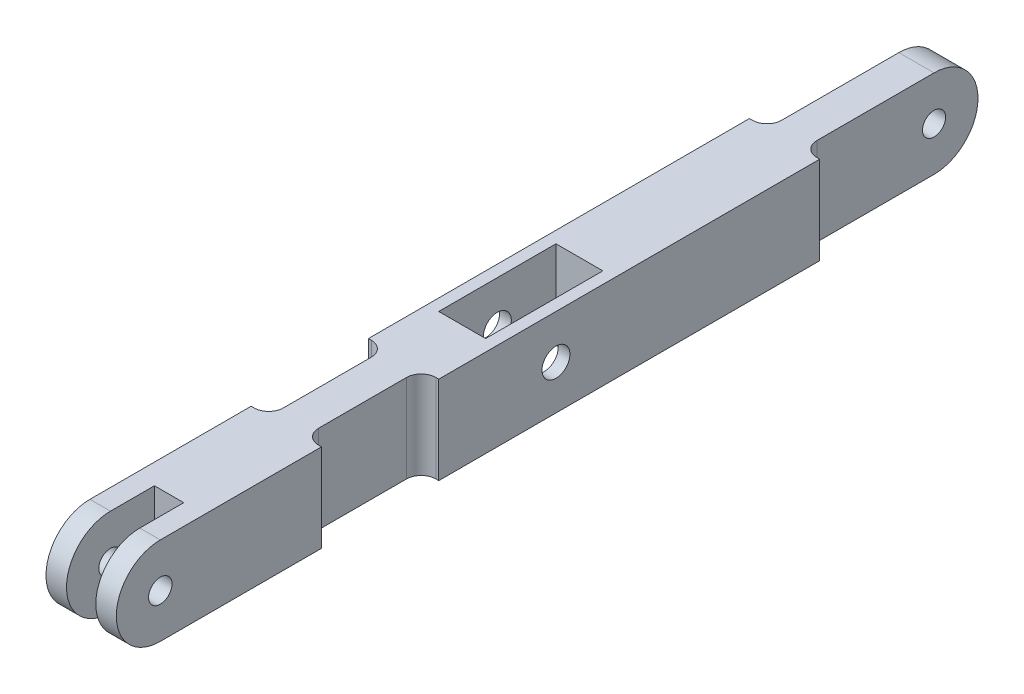
ISO-10303-21;
HEADER;
FILE_DESCRIPTION(('STEP AP214'),'2;1');
FILE_NAME('part.step','',(''),(''),'','','');
FILE_SCHEMA(('AUTOMOTIVE_DESIGN { 1 0 10303 214 1 1 1 1 }'));
ENDSEC;
DATA;
#1=APPLICATION_CONTEXT('core data for automotive mechanical design processes');
#2=APPLICATION_PROTOCOL_DEFINITION('international standard','automotive_design',2000,#1);
#3=PRODUCT_CONTEXT('',#1,'mechanical');
#4=PRODUCT('Part','Part','',(#3));
#5=PRODUCT_RELATED_PRODUCT_CATEGORY('part','',(#4));
#6=PRODUCT_DEFINITION_FORMATION('','',#4);
#7=PRODUCT_DEFINITION_CONTEXT('part definition',#1,'design');
#8=PRODUCT_DEFINITION('design','',#6,#7);
#9=PRODUCT_DEFINITION_SHAPE('','',#8);
#10=(LENGTH_UNIT() NAMED_UNIT(*) SI_UNIT(.MILLI.,.METRE.));
#11=(NAMED_UNIT(*) PLANE_ANGLE_UNIT() SI_UNIT($,.RADIAN.));
#12=(NAMED_UNIT(*) SI_UNIT($,.STERADIAN.) SOLID_ANGLE_UNIT());
#13=UNCERTAINTY_MEASURE_WITH_UNIT(LENGTH_MEASURE(1.E-05),#10,'distance_accuracy_value','');
#14=(GEOMETRIC_REPRESENTATION_CONTEXT(3) GLOBAL_UNCERTAINTY_ASSIGNED_CONTEXT((#13)) GLOBAL_UNIT_ASSIGNED_CONTEXT((#10,
#11,#12)) REPRESENTATION_CONTEXT('',''));
#15=CARTESIAN_POINT('',(0.,0.,0.));
#16=DIRECTION('',(0.,0.,1.));
#17=DIRECTION('',(1.,0.,0.));
#18=AXIS2_PLACEMENT_3D('',#15,#16,#17);
#19=CARTESIAN_POINT('',(6.,0.,67.5));
#20=DIRECTION('',(1.,0.,0.));
#21=DIRECTION('',(0.,0.,-1.));
#22=AXIS2_PLACEMENT_3D('',#19,#20,#21);
#23=PLANE('',#22);
#24=DIRECTION('',(0.,-1.,0.));
#25=VECTOR('',#24,1.);
#26=CARTESIAN_POINT('',(6.,0.,-45.));
#27=LINE('',#26,#25);
#28=CARTESIAN_POINT('',(6.,7.50000000000002,-45.));
#29=VERTEX_POINT('',#28);
#30=CARTESIAN_POINT('',(6.,-7.50000000000002,-45.));
#31=VERTEX_POINT('',#30);
#32=EDGE_CURVE('E362',#29,#31,#27,.T.);
#33=ORIENTED_EDGE('',*,*,#32,.F.);
#34=DIRECTION('',(0.,0.,1.));
#35=VECTOR('',#34,1.);
#36=CARTESIAN_POINT('',(6.,7.5,67.5));
#37=LINE('',#36,#35);
#38=CARTESIAN_POINT('',(6.,7.50000000000002,20.));
#39=VERTEX_POINT('',#38);
#40=EDGE_CURVE('E394',#29,#39,#37,.T.);
#41=ORIENTED_EDGE('',*,*,#40,.T.);
#42=DIRECTION('',(0.,1.,0.));
#43=VECTOR('',#42,1.);
#44=CARTESIAN_POINT('',(6.,0.,20.));
#45=LINE('',#44,#43);
#46=CARTESIAN_POINT('',(6.,-7.50000000000002,20.));
#47=VERTEX_POINT('',#46);
#48=EDGE_CURVE('E356',#47,#39,#45,.T.);
#49=ORIENTED_EDGE('',*,*,#48,.F.);
#50=DIRECTION('',(0.,0.,-1.));
#51=VECTOR('',#50,1.);
#52=CARTESIAN_POINT('',(6.,-7.5,67.5));
#53=LINE('',#52,#51);
#54=EDGE_CURVE('E387',#47,#31,#53,.T.);
#55=ORIENTED_EDGE('',*,*,#54,.T.);
#56=EDGE_LOOP('',(#33,#41,#49,#55));
#57=FACE_BOUND('',#56,.T.);
#58=CARTESIAN_POINT('',(6.,0.,0.));
#59=DIRECTION('',(1.,0.,0.));
#60=DIRECTION('',(0.,0.,-1.));
#61=AXIS2_PLACEMENT_3D('',#58,#59,#60);
#62=CIRCLE('',#61,2.38125);
#63=CARTESIAN_POINT('',(6.,0.,-2.38125));
#64=VERTEX_POINT('',#63);
#65=EDGE_CURVE('E372',#64,#64,#62,.T.);
#66=ORIENTED_EDGE('',*,*,#65,.F.);
#67=EDGE_LOOP('',(#66));
#68=FACE_BOUND('',#67,.T.);
#69=ADVANCED_FACE('F37',(#57,#68),#23,.T.);
#70=CARTESIAN_POINT('',(-6.,0.,67.5));
#71=DIRECTION('',(1.,0.,0.));
#72=DIRECTION('',(0.,0.,-1.));
#73=AXIS2_PLACEMENT_3D('',#70,#71,#72);
#74=PLANE('',#73);
#75=CARTESIAN_POINT('',(-6.,0.,67.5));
#76=DIRECTION('',(1.,0.,0.));
#77=DIRECTION('',(0.,0.,-1.));
#78=AXIS2_PLACEMENT_3D('',#75,#76,#77);
#79=CIRCLE('',#78,2.);
#80=CARTESIAN_POINT('',(-6.,0.,65.5));
#81=VERTEX_POINT('',#80);
#82=EDGE_CURVE('E375',#81,#81,#79,.T.);
#83=ORIENTED_EDGE('',*,*,#82,.T.);
#84=EDGE_LOOP('',(#83));
#85=FACE_BOUND('',#84,.T.);
#86=DIRECTION('',(0.,0.,1.));
#87=VECTOR('',#86,1.);
#88=CARTESIAN_POINT('',(-6.,7.5,67.5));
#89=LINE('',#88,#87);
#90=CARTESIAN_POINT('',(-6.,7.50000000000002,40.));
#91=VERTEX_POINT('',#90);
#92=CARTESIAN_POINT('',(-6.,7.5,67.5));
#93=VERTEX_POINT('',#92);
#94=EDGE_CURVE('E401',#91,#93,#89,.T.);
#95=ORIENTED_EDGE('',*,*,#94,.F.);
#96=DIRECTION('',(0.,-1.,0.));
#97=VECTOR('',#96,1.);
#98=CARTESIAN_POINT('',(-6.,0.,40.));
#99=LINE('',#98,#97);
#100=CARTESIAN_POINT('',(-6.,-7.50000000000002,40.));
#101=VERTEX_POINT('',#100);
#102=EDGE_CURVE('E368',#91,#101,#99,.T.);
#103=ORIENTED_EDGE('',*,*,#102,.T.);
#104=DIRECTION('',(0.,0.,-1.));
#105=VECTOR('',#104,1.);
#106=CARTESIAN_POINT('',(-6.,-7.5,67.5));
#107=LINE('',#106,#105);
#108=CARTESIAN_POINT('',(-6.,-7.5,67.5));
#109=VERTEX_POINT('',#108);
#110=EDGE_CURVE('E398',#109,#101,#107,.T.);
#111=ORIENTED_EDGE('',*,*,#110,.F.);
#112=CARTESIAN_POINT('',(-6.,0.,67.5));
#113=DIRECTION('',(1.,0.,0.));
#114=DIRECTION('',(0.,0.,-1.));
#115=AXIS2_PLACEMENT_3D('',#112,#113,#114);
#116=CIRCLE('',#115,7.5);
#117=EDGE_CURVE('E381',#93,#109,#116,.T.);
#118=ORIENTED_EDGE('',*,*,#117,.F.);
#119=EDGE_LOOP('',(#95,#103,#111,#118));
#120=FACE_BOUND('',#119,.T.);
#121=ADVANCED_FACE('F518',(#85,#120),#74,.F.);
#122=CARTESIAN_POINT('',(6.,0.,67.5));
#123=DIRECTION('',(-1.,0.,0.));
#124=DIRECTION('',(0.,0.,1.));
#125=AXIS2_PLACEMENT_3D('',#122,#123,#124);
#126=CYLINDRICAL_SURFACE('',#125,7.5);
#127=DIRECTION('',(-1.,0.,0.));
#128=VECTOR('',#127,1.);
#129=CARTESIAN_POINT('',(6.,-7.5,67.5));
#130=LINE('',#129,#128);
#131=CARTESIAN_POINT('',(-2.5,-7.50000000000002,67.5));
#132=VERTEX_POINT('',#131);
#133=EDGE_CURVE('E414',#132,#109,#130,.T.);
#134=ORIENTED_EDGE('',*,*,#133,.F.);
#135=CARTESIAN_POINT('',(-2.5,0.,67.5));
#136=DIRECTION('',(-1.,0.,0.));
#137=DIRECTION('',(0.,0.,1.));
#138=AXIS2_PLACEMENT_3D('',#135,#136,#137);
#139=CIRCLE('',#138,7.5);
#140=CARTESIAN_POINT('',(-2.5,7.50000000000002,67.5));
#141=VERTEX_POINT('',#140);
#142=EDGE_CURVE('E350',#132,#141,#139,.T.);
#143=ORIENTED_EDGE('',*,*,#142,.T.);
#144=DIRECTION('',(-1.,0.,0.));
#145=VECTOR('',#144,1.);
#146=CARTESIAN_POINT('',(6.,7.5,67.5));
#147=LINE('',#146,#145);
#148=EDGE_CURVE('E408',#141,#93,#147,.T.);
#149=ORIENTED_EDGE('',*,*,#148,.T.);
#150=ORIENTED_EDGE('',*,*,#117,.T.);
#151=EDGE_LOOP('',(#134,#143,#149,#150));
#152=FACE_BOUND('',#151,.T.);
#153=ADVANCED_FACE('F571',(#152),#126,.T.);
#154=CARTESIAN_POINT('',(6.,0.,67.5));
#155=DIRECTION('',(-1.,0.,0.));
#156=DIRECTION('',(0.,0.,1.));
#157=AXIS2_PLACEMENT_3D('',#154,#155,#156);
#158=CYLINDRICAL_SURFACE('',#157,2.);
#159=CARTESIAN_POINT('',(-2.5,0.,67.5));
#160=DIRECTION('',(-1.,0.,0.));
#161=DIRECTION('',(0.,0.,1.));
#162=AXIS2_PLACEMENT_3D('',#159,#160,#161);
#163=CIRCLE('',#162,2.);
#164=CARTESIAN_POINT('',(-2.5,0.,69.5));
#165=VERTEX_POINT('',#164);
#166=EDGE_CURVE('E348',#165,#165,#163,.T.);
#167=ORIENTED_EDGE('',*,*,#166,.F.);
#168=EDGE_LOOP('',(#167));
#169=FACE_BOUND('',#168,.T.);
#170=ORIENTED_EDGE('',*,*,#82,.F.);
#171=EDGE_LOOP('',(#170));
#172=FACE_BOUND('',#171,.T.);
#173=ADVANCED_FACE('F601',(#169,#172),#158,.F.);
#174=CARTESIAN_POINT('',(6.,0.,0.));
#175=DIRECTION('',(-1.,0.,0.));
#176=DIRECTION('',(0.,0.,1.));
#177=AXIS2_PLACEMENT_3D('',#174,#175,#176);
#178=CYLINDRICAL_SURFACE('',#177,2.38125);
#179=CARTESIAN_POINT('',(4.,0.,0.));
#180=DIRECTION('',(1.,0.,0.));
#181=DIRECTION('',(0.,0.,-1.));
#182=AXIS2_PLACEMENT_3D('',#179,#180,#181);
#183=CIRCLE('',#182,2.38125);
#184=CARTESIAN_POINT('',(4.,0.,-2.38125));
#185=VERTEX_POINT('',#184);
#186=EDGE_CURVE('E425',#185,#185,#183,.T.);
#187=ORIENTED_EDGE('',*,*,#186,.F.);
#188=EDGE_LOOP('',(#187));
#189=FACE_BOUND('',#188,.T.);
#190=ORIENTED_EDGE('',*,*,#65,.T.);
#191=EDGE_LOOP('',(#190));
#192=FACE_BOUND('',#191,.T.);
#193=ADVANCED_FACE('F595',(#189,#192),#178,.F.);
#194=DIRECTION('',(0.,-1.,0.));
#195=VECTOR('',#194,1.);
#196=CARTESIAN_POINT('',(6.,0.,40.));
#197=LINE('',#196,#195);
#198=CARTESIAN_POINT('',(6.,7.50000000000002,40.));
#199=VERTEX_POINT('',#198);
#200=CARTESIAN_POINT('',(6.,-7.50000000000002,40.));
#201=VERTEX_POINT('',#200);
#202=EDGE_CURVE('E353',#199,#201,#197,.T.);
#203=ORIENTED_EDGE('',*,*,#202,.F.);
#204=CARTESIAN_POINT('',(6.,7.5,67.5));
#205=VERTEX_POINT('',#204);
#206=EDGE_CURVE('E392',#199,#205,#37,.T.);
#207=ORIENTED_EDGE('',*,*,#206,.T.);
#208=CARTESIAN_POINT('',(6.,0.,67.5));
#209=DIRECTION('',(1.,0.,0.));
#210=DIRECTION('',(0.,0.,-1.));
#211=AXIS2_PLACEMENT_3D('',#208,#209,#210);
#212=CIRCLE('',#211,7.5);
#213=CARTESIAN_POINT('',(6.,-7.5,67.5));
#214=VERTEX_POINT('',#213);
#215=EDGE_CURVE('E384',#205,#214,#212,.T.);
#216=ORIENTED_EDGE('',*,*,#215,.T.);
#217=EDGE_CURVE('E389',#214,#201,#53,.T.);
#218=ORIENTED_EDGE('',*,*,#217,.T.);
#219=EDGE_LOOP('',(#203,#207,#216,#218));
#220=FACE_BOUND('',#219,.T.);
#221=CARTESIAN_POINT('',(6.,0.,67.5));
#222=DIRECTION('',(1.,0.,0.));
#223=DIRECTION('',(0.,0.,-1.));
#224=AXIS2_PLACEMENT_3D('',#221,#222,#223);
#225=CIRCLE('',#224,2.);
#226=CARTESIAN_POINT('',(6.,0.,65.5));
#227=VERTEX_POINT('',#226);
#228=EDGE_CURVE('E378',#227,#227,#225,.T.);
#229=ORIENTED_EDGE('',*,*,#228,.F.);
#230=EDGE_LOOP('',(#229));
#231=FACE_BOUND('',#230,.T.);
#232=ADVANCED_FACE('F557',(#220,#231),#23,.T.);
#233=CARTESIAN_POINT('',(-6.,-7.50000000000002,20.));
#234=VERTEX_POINT('',#233);
#235=CARTESIAN_POINT('',(-6.,-7.50000000000002,-45.));
#236=VERTEX_POINT('',#235);
#237=EDGE_CURVE('E397',#234,#236,#107,.T.);
#238=ORIENTED_EDGE('',*,*,#237,.F.);
#239=DIRECTION('',(0.,1.,0.));
#240=VECTOR('',#239,1.);
#241=CARTESIAN_POINT('',(-6.,0.,20.));
#242=LINE('',#241,#240);
#243=CARTESIAN_POINT('',(-6.,7.50000000000002,20.));
#244=VERTEX_POINT('',#243);
#245=EDGE_CURVE('E365',#234,#244,#242,.T.);
#246=ORIENTED_EDGE('',*,*,#245,.T.);
#247=CARTESIAN_POINT('',(-6.,7.50000000000002,-45.));
#248=VERTEX_POINT('',#247);
#249=EDGE_CURVE('E388',#248,#244,#89,.T.);
#250=ORIENTED_EDGE('',*,*,#249,.F.);
#251=DIRECTION('',(0.,-1.,0.));
#252=VECTOR('',#251,1.);
#253=CARTESIAN_POINT('',(-6.,0.,-45.));
#254=LINE('',#253,#252);
#255=EDGE_CURVE('E359',#248,#236,#254,.T.);
#256=ORIENTED_EDGE('',*,*,#255,.T.);
#257=EDGE_LOOP('',(#238,#246,#250,#256));
#258=FACE_BOUND('',#257,.T.);
#259=CARTESIAN_POINT('',(-6.,0.,0.));
#260=DIRECTION('',(1.,0.,0.));
#261=DIRECTION('',(0.,0.,-1.));
#262=AXIS2_PLACEMENT_3D('',#259,#260,#261);
#263=CIRCLE('',#262,2.38125);
#264=CARTESIAN_POINT('',(-6.,0.,-2.38125));
#265=VERTEX_POINT('',#264);
#266=EDGE_CURVE('E371',#265,#265,#263,.T.);
#267=ORIENTED_EDGE('',*,*,#266,.T.);
#268=EDGE_LOOP('',(#267));
#269=FACE_BOUND('',#268,.T.);
#270=ADVANCED_FACE('F592',(#258,#269),#74,.F.);
#271=CARTESIAN_POINT('',(2.5,7.5,67.5));
#272=VERTEX_POINT('',#271);
#273=EDGE_CURVE('E404',#205,#272,#147,.T.);
#274=ORIENTED_EDGE('',*,*,#273,.T.);
#275=CARTESIAN_POINT('',(2.5,0.,67.5));
#276=DIRECTION('',(1.,0.,0.));
#277=DIRECTION('',(0.,0.,-1.));
#278=AXIS2_PLACEMENT_3D('',#275,#276,#277);
#279=CIRCLE('',#278,7.5);
#280=CARTESIAN_POINT('',(2.5,-7.50000000000002,67.5));
#281=VERTEX_POINT('',#280);
#282=EDGE_CURVE('E345',#272,#281,#279,.T.);
#283=ORIENTED_EDGE('',*,*,#282,.T.);
#284=EDGE_CURVE('E415',#214,#281,#130,.T.);
#285=ORIENTED_EDGE('',*,*,#284,.F.);
#286=ORIENTED_EDGE('',*,*,#215,.F.);
#287=EDGE_LOOP('',(#274,#283,#285,#286));
#288=FACE_BOUND('',#287,.T.);
#289=ADVANCED_FACE('F561',(#288),#126,.T.);
#290=CARTESIAN_POINT('',(6.,-7.5,67.5));
#291=DIRECTION('',(0.,1.,0.));
#292=DIRECTION('',(0.,0.,1.));
#293=AXIS2_PLACEMENT_3D('',#290,#291,#292);
#294=PLANE('',#293);
#295=DIRECTION('',(1.,0.,0.));
#296=VECTOR('',#295,1.);
#297=CARTESIAN_POINT('',(-4.,-7.50000000000002,10.));
#298=LINE('',#297,#296);
#299=CARTESIAN_POINT('',(-4.,-7.50000000000002,10.));
#300=VERTEX_POINT('',#299);
#301=CARTESIAN_POINT('',(4.,-7.50000000000002,10.));
#302=VERTEX_POINT('',#301);
#303=EDGE_CURVE('E267',#300,#302,#298,.T.);
#304=ORIENTED_EDGE('',*,*,#303,.T.);
#305=DIRECTION('',(0.,0.,-1.));
#306=VECTOR('',#305,1.);
#307=CARTESIAN_POINT('',(4.,-7.50000000000002,10.));
#308=LINE('',#307,#306);
#309=CARTESIAN_POINT('',(4.,-7.50000000000002,-10.));
#310=VERTEX_POINT('',#309);
#311=EDGE_CURVE('E258',#302,#310,#308,.T.);
#312=ORIENTED_EDGE('',*,*,#311,.T.);
#313=DIRECTION('',(-1.,0.,0.));
#314=VECTOR('',#313,1.);
#315=CARTESIAN_POINT('',(-4.,-7.50000000000002,-10.));
#316=LINE('',#315,#314);
#317=CARTESIAN_POINT('',(-4.,-7.49999999999998,-9.99999999999999));
#318=VERTEX_POINT('',#317);
#319=EDGE_CURVE('E264',#310,#318,#316,.T.);
#320=ORIENTED_EDGE('',*,*,#319,.T.);
#321=DIRECTION('',(0.,0.,1.));
#322=VECTOR('',#321,1.);
#323=CARTESIAN_POINT('',(-4.,-7.50000000000002,10.));
#324=LINE('',#323,#322);
#325=EDGE_CURVE('E239',#318,#300,#324,.T.);
#326=ORIENTED_EDGE('',*,*,#325,.T.);
#327=EDGE_LOOP('',(#304,#312,#320,#326));
#328=FACE_BOUND('',#327,.T.);
#329=DIRECTION('',(-1.,0.,0.));
#330=VECTOR('',#329,1.);
#331=CARTESIAN_POINT('',(-2.5,-7.50000000000002,59.9999999999999));
#332=LINE('',#331,#330);
#333=CARTESIAN_POINT('',(2.5,-7.50000000000002,59.9999999999999));
#334=VERTEX_POINT('',#333);
#335=CARTESIAN_POINT('',(-2.5,-7.50000000000002,59.9999999999999));
#336=VERTEX_POINT('',#335);
#337=EDGE_CURVE('E286',#334,#336,#332,.T.);
#338=ORIENTED_EDGE('',*,*,#337,.T.);
#339=DIRECTION('',(0.,0.,1.));
#340=VECTOR('',#339,1.);
#341=CARTESIAN_POINT('',(-2.5,-7.50000000000002,89.9999999999999));
#342=LINE('',#341,#340);
#343=EDGE_CURVE('E289',#336,#132,#342,.T.);
#344=ORIENTED_EDGE('',*,*,#343,.T.);
#345=ORIENTED_EDGE('',*,*,#133,.T.);
#346=ORIENTED_EDGE('',*,*,#110,.T.);
#347=DIRECTION('',(1.,0.,0.));
#348=VECTOR('',#347,1.);
#349=CARTESIAN_POINT('',(-9.,-7.50000000000002,40.));
#350=LINE('',#349,#348);
#351=CARTESIAN_POINT('',(-5.5,-7.50000000000002,40.));
#352=VERTEX_POINT('',#351);
#353=EDGE_CURVE('E278',#101,#352,#350,.T.);
#354=ORIENTED_EDGE('',*,*,#353,.T.);
#355=CARTESIAN_POINT('',(-5.5,-7.49999999999999,37.5));
#356=DIRECTION('',(0.,1.,0.));
#357=DIRECTION('',(0.,0.,1.));
#358=AXIS2_PLACEMENT_3D('',#355,#356,#357);
#359=CIRCLE('',#358,2.5);
#360=CARTESIAN_POINT('',(-3.,-7.50000000000002,37.5));
#361=VERTEX_POINT('',#360);
#362=EDGE_CURVE('E480',#352,#361,#359,.T.);
#363=ORIENTED_EDGE('',*,*,#362,.T.);
#364=DIRECTION('',(0.,0.,-1.));
#365=VECTOR('',#364,1.);
#366=CARTESIAN_POINT('',(-3.,-7.50000000000002,40.));
#367=LINE('',#366,#365);
#368=CARTESIAN_POINT('',(-3.,-7.50000000000002,22.5));
#369=VERTEX_POINT('',#368);
#370=EDGE_CURVE('E304',#361,#369,#367,.T.);
#371=ORIENTED_EDGE('',*,*,#370,.T.);
#372=CARTESIAN_POINT('',(-5.5,-7.49999999999999,22.5));
#373=DIRECTION('',(0.,1.,0.));
#374=DIRECTION('',(0.,0.,1.));
#375=AXIS2_PLACEMENT_3D('',#372,#373,#374);
#376=CIRCLE('',#375,2.5);
#377=CARTESIAN_POINT('',(-5.5,-7.50000000000002,20.));
#378=VERTEX_POINT('',#377);
#379=EDGE_CURVE('E484',#369,#378,#376,.T.);
#380=ORIENTED_EDGE('',*,*,#379,.T.);
#381=DIRECTION('',(-1.,0.,0.));
#382=VECTOR('',#381,1.);
#383=CARTESIAN_POINT('',(-9.,-7.50000000000002,20.));
#384=LINE('',#383,#382);
#385=EDGE_CURVE('E307',#378,#234,#384,.T.);
#386=ORIENTED_EDGE('',*,*,#385,.T.);
#387=ORIENTED_EDGE('',*,*,#237,.T.);
#388=DIRECTION('',(1.,0.,0.));
#389=VECTOR('',#388,1.);
#390=CARTESIAN_POINT('',(-9.,-7.50000000000002,-45.));
#391=LINE('',#390,#389);
#392=CARTESIAN_POINT('',(-5.5,-7.50000000000002,-45.));
#393=VERTEX_POINT('',#392);
#394=EDGE_CURVE('E322',#236,#393,#391,.T.);
#395=ORIENTED_EDGE('',*,*,#394,.T.);
#396=CARTESIAN_POINT('',(-5.5,-7.49999999999998,-47.5));
#397=DIRECTION('',(0.,1.,0.));
#398=DIRECTION('',(0.,0.,1.));
#399=AXIS2_PLACEMENT_3D('',#396,#397,#398);
#400=CIRCLE('',#399,2.5);
#401=CARTESIAN_POINT('',(-3.,-7.50000000000002,-47.5));
#402=VERTEX_POINT('',#401);
#403=EDGE_CURVE('E11',#393,#402,#400,.T.);
#404=ORIENTED_EDGE('',*,*,#403,.T.);
#405=DIRECTION('',(0.,0.,-1.));
#406=VECTOR('',#405,1.);
#407=CARTESIAN_POINT('',(-3.,-7.50000000000002,-45.));
#408=LINE('',#407,#406);
#409=CARTESIAN_POINT('',(-3.,-7.50000000000002,-67.5));
#410=VERTEX_POINT('',#409);
#411=EDGE_CURVE('E315',#402,#410,#408,.T.);
#412=ORIENTED_EDGE('',*,*,#411,.T.);
#413=DIRECTION('',(-1.,0.,0.));
#414=VECTOR('',#413,1.);
#415=CARTESIAN_POINT('',(6.,-7.5,-67.5));
#416=LINE('',#415,#414);
#417=CARTESIAN_POINT('',(3.,-7.50000000000002,-67.5));
#418=VERTEX_POINT('',#417);
#419=EDGE_CURVE('E411',#418,#410,#416,.T.);
#420=ORIENTED_EDGE('',*,*,#419,.F.);
#421=DIRECTION('',(0.,0.,1.));
#422=VECTOR('',#421,1.);
#423=CARTESIAN_POINT('',(3.,-7.50000000000002,-45.));
#424=LINE('',#423,#422);
#425=CARTESIAN_POINT('',(3.,-7.50000000000002,-47.5));
#426=VERTEX_POINT('',#425);
#427=EDGE_CURVE('E317',#418,#426,#424,.T.);
#428=ORIENTED_EDGE('',*,*,#427,.T.);
#429=CARTESIAN_POINT('',(5.5,-7.49999999999998,-47.5));
#430=DIRECTION('',(0.,1.,0.));
#431=DIRECTION('',(0.,0.,1.));
#432=AXIS2_PLACEMENT_3D('',#429,#430,#431);
#433=CIRCLE('',#432,2.5);
#434=CARTESIAN_POINT('',(5.5,-7.50000000000002,-45.));
#435=VERTEX_POINT('',#434);
#436=EDGE_CURVE('E468',#426,#435,#433,.T.);
#437=ORIENTED_EDGE('',*,*,#436,.T.);
#438=DIRECTION('',(1.,0.,0.));
#439=VECTOR('',#438,1.);
#440=CARTESIAN_POINT('',(9.,-7.50000000000002,-45.));
#441=LINE('',#440,#439);
#442=EDGE_CURVE('E302',#435,#31,#441,.T.);
#443=ORIENTED_EDGE('',*,*,#442,.T.);
#444=ORIENTED_EDGE('',*,*,#54,.F.);
#445=DIRECTION('',(-1.,0.,0.));
#446=VECTOR('',#445,1.);
#447=CARTESIAN_POINT('',(9.,-7.50000000000002,20.));
#448=LINE('',#447,#446);
#449=CARTESIAN_POINT('',(5.5,-7.50000000000002,20.));
#450=VERTEX_POINT('',#449);
#451=EDGE_CURVE('E329',#47,#450,#448,.T.);
#452=ORIENTED_EDGE('',*,*,#451,.T.);
#453=CARTESIAN_POINT('',(5.5,-7.49999999999999,22.5));
#454=DIRECTION('',(0.,1.,0.));
#455=DIRECTION('',(0.,0.,1.));
#456=AXIS2_PLACEMENT_3D('',#453,#454,#455);
#457=CIRCLE('',#456,2.5);
#458=CARTESIAN_POINT('',(3.,-7.50000000000002,22.5));
#459=VERTEX_POINT('',#458);
#460=EDGE_CURVE('E476',#450,#459,#457,.T.);
#461=ORIENTED_EDGE('',*,*,#460,.T.);
#462=DIRECTION('',(0.,0.,1.));
#463=VECTOR('',#462,1.);
#464=CARTESIAN_POINT('',(3.,-7.50000000000002,40.));
#465=LINE('',#464,#463);
#466=CARTESIAN_POINT('',(3.,-7.50000000000002,37.5));
#467=VERTEX_POINT('',#466);
#468=EDGE_CURVE('E332',#459,#467,#465,.T.);
#469=ORIENTED_EDGE('',*,*,#468,.T.);
#470=CARTESIAN_POINT('',(5.5,-7.49999999999999,37.5));
#471=DIRECTION('',(0.,1.,0.));
#472=DIRECTION('',(0.,0.,1.));
#473=AXIS2_PLACEMENT_3D('',#470,#471,#472);
#474=CIRCLE('',#473,2.5);
#475=CARTESIAN_POINT('',(5.5,-7.50000000000002,40.));
#476=VERTEX_POINT('',#475);
#477=EDGE_CURVE('E472',#467,#476,#474,.T.);
#478=ORIENTED_EDGE('',*,*,#477,.T.);
#479=DIRECTION('',(1.,0.,0.));
#480=VECTOR('',#479,1.);
#481=CARTESIAN_POINT('',(9.,-7.50000000000002,40.));
#482=LINE('',#481,#480);
#483=EDGE_CURVE('E335',#476,#201,#482,.T.);
#484=ORIENTED_EDGE('',*,*,#483,.T.);
#485=ORIENTED_EDGE('',*,*,#217,.F.);
#486=ORIENTED_EDGE('',*,*,#284,.T.);
#487=DIRECTION('',(0.,0.,-1.));
#488=VECTOR('',#487,1.);
#489=CARTESIAN_POINT('',(2.5,-7.50000000000002,89.9999999999999));
#490=LINE('',#489,#488);
#491=EDGE_CURVE('E283',#281,#334,#490,.T.);
#492=ORIENTED_EDGE('',*,*,#491,.T.);
#493=EDGE_LOOP('',(#338,#344,#345,#346,#354,#363,#371,#380,#386,#387,#395,#404,#412,#420,#428,
#437,#443,#444,#452,#461,#469,#478,#484,#485,#486,#492));
#494=FACE_BOUND('',#493,.T.);
#495=ADVANCED_FACE('F488',(#328,#494),#294,.F.);
#496=CARTESIAN_POINT('',(6.,0.,-67.5));
#497=DIRECTION('',(-1.,0.,0.));
#498=DIRECTION('',(0.,0.,1.));
#499=AXIS2_PLACEMENT_3D('',#496,#497,#498);
#500=CYLINDRICAL_SURFACE('',#499,7.5);
#501=DIRECTION('',(-1.,0.,0.));
#502=VECTOR('',#501,1.);
#503=CARTESIAN_POINT('',(6.,7.50000000000002,-67.5));
#504=LINE('',#503,#502);
#505=CARTESIAN_POINT('',(3.,7.50000000000002,-67.5));
#506=VERTEX_POINT('',#505);
#507=CARTESIAN_POINT('',(-3.,7.50000000000002,-67.5));
#508=VERTEX_POINT('',#507);
#509=EDGE_CURVE('E407',#506,#508,#504,.T.);
#510=ORIENTED_EDGE('',*,*,#509,.F.);
#511=CARTESIAN_POINT('',(3.,0.,-67.5));
#512=DIRECTION('',(-1.,0.,0.));
#513=DIRECTION('',(0.,0.,1.));
#514=AXIS2_PLACEMENT_3D('',#511,#512,#513);
#515=CIRCLE('',#514,7.5);
#516=EDGE_CURVE('E342',#506,#418,#515,.T.);
#517=ORIENTED_EDGE('',*,*,#516,.T.);
#518=ORIENTED_EDGE('',*,*,#419,.T.);
#519=CARTESIAN_POINT('',(-3.,0.,-67.5));
#520=DIRECTION('',(1.,0.,0.));
#521=DIRECTION('',(0.,0.,-1.));
#522=AXIS2_PLACEMENT_3D('',#519,#520,#521);
#523=CIRCLE('',#522,7.5);
#524=EDGE_CURVE('E338',#410,#508,#523,.T.);
#525=ORIENTED_EDGE('',*,*,#524,.T.);
#526=EDGE_LOOP('',(#510,#517,#518,#525));
#527=FACE_BOUND('',#526,.T.);
#528=ADVANCED_FACE('F651',(#527),#500,.T.);
#529=CARTESIAN_POINT('',(6.,7.5,67.5));
#530=DIRECTION('',(0.,-1.,0.));
#531=DIRECTION('',(0.,0.,-1.));
#532=AXIS2_PLACEMENT_3D('',#529,#530,#531);
#533=PLANE('',#532);
#534=DIRECTION('',(-1.,0.,0.));
#535=VECTOR('',#534,1.);
#536=CARTESIAN_POINT('',(-4.,7.50000000000002,-10.));
#537=LINE('',#536,#535);
#538=CARTESIAN_POINT('',(4.,7.50000000000001,-9.99999999999999));
#539=VERTEX_POINT('',#538);
#540=CARTESIAN_POINT('',(-4.,7.50000000000002,-10.));
#541=VERTEX_POINT('',#540);
#542=EDGE_CURVE('E248',#539,#541,#537,.T.);
#543=ORIENTED_EDGE('',*,*,#542,.F.);
#544=DIRECTION('',(0.,0.,-1.));
#545=VECTOR('',#544,1.);
#546=CARTESIAN_POINT('',(4.,7.50000000000002,10.));
#547=LINE('',#546,#545);
#548=CARTESIAN_POINT('',(4.,7.50000000000002,10.));
#549=VERTEX_POINT('',#548);
#550=EDGE_CURVE('E252',#549,#539,#547,.T.);
#551=ORIENTED_EDGE('',*,*,#550,.F.);
#552=DIRECTION('',(1.,0.,0.));
#553=VECTOR('',#552,1.);
#554=CARTESIAN_POINT('',(-4.,7.50000000000002,10.));
#555=LINE('',#554,#553);
#556=CARTESIAN_POINT('',(-4.,7.50000000000002,10.));
#557=VERTEX_POINT('',#556);
#558=EDGE_CURVE('E256',#557,#549,#555,.T.);
#559=ORIENTED_EDGE('',*,*,#558,.F.);
#560=DIRECTION('',(0.,0.,1.));
#561=VECTOR('',#560,1.);
#562=CARTESIAN_POINT('',(-4.,7.50000000000002,10.));
#563=LINE('',#562,#561);
#564=EDGE_CURVE('E236',#541,#557,#563,.T.);
#565=ORIENTED_EDGE('',*,*,#564,.F.);
#566=EDGE_LOOP('',(#543,#551,#559,#565));
#567=FACE_BOUND('',#566,.T.);
#568=ORIENTED_EDGE('',*,*,#148,.F.);
#569=DIRECTION('',(0.,0.,1.));
#570=VECTOR('',#569,1.);
#571=CARTESIAN_POINT('',(-2.5,7.50000000000002,89.9999999999999));
#572=LINE('',#571,#570);
#573=CARTESIAN_POINT('',(-2.5,7.50000000000002,59.9999999999999));
#574=VERTEX_POINT('',#573);
#575=EDGE_CURVE('E281',#574,#141,#572,.T.);
#576=ORIENTED_EDGE('',*,*,#575,.F.);
#577=DIRECTION('',(-1.,0.,0.));
#578=VECTOR('',#577,1.);
#579=CARTESIAN_POINT('',(-2.5,7.50000000000002,59.9999999999999));
#580=LINE('',#579,#578);
#581=CARTESIAN_POINT('',(2.5,7.50000000000002,59.9999999999999));
#582=VERTEX_POINT('',#581);
#583=EDGE_CURVE('E277',#582,#574,#580,.T.);
#584=ORIENTED_EDGE('',*,*,#583,.F.);
#585=DIRECTION('',(0.,0.,-1.));
#586=VECTOR('',#585,1.);
#587=CARTESIAN_POINT('',(2.5,7.50000000000002,89.9999999999999));
#588=LINE('',#587,#586);
#589=EDGE_CURVE('E275',#272,#582,#588,.T.);
#590=ORIENTED_EDGE('',*,*,#589,.F.);
#591=ORIENTED_EDGE('',*,*,#273,.F.);
#592=ORIENTED_EDGE('',*,*,#206,.F.);
#593=DIRECTION('',(1.,0.,0.));
#594=VECTOR('',#593,1.);
#595=CARTESIAN_POINT('',(9.,7.50000000000002,40.));
#596=LINE('',#595,#594);
#597=CARTESIAN_POINT('',(5.5,7.50000000000002,40.));
#598=VERTEX_POINT('',#597);
#599=EDGE_CURVE('E327',#598,#199,#596,.T.);
#600=ORIENTED_EDGE('',*,*,#599,.F.);
#601=CARTESIAN_POINT('',(5.5,7.5,37.5));
#602=DIRECTION('',(0.,-1.,0.));
#603=DIRECTION('',(0.,0.,-1.));
#604=AXIS2_PLACEMENT_3D('',#601,#602,#603);
#605=CIRCLE('',#604,2.5);
#606=CARTESIAN_POINT('',(3.,7.50000000000002,37.5));
#607=VERTEX_POINT('',#606);
#608=EDGE_CURVE('E470',#598,#607,#605,.T.);
#609=ORIENTED_EDGE('',*,*,#608,.T.);
#610=DIRECTION('',(0.,0.,1.));
#611=VECTOR('',#610,1.);
#612=CARTESIAN_POINT('',(3.,7.50000000000002,40.));
#613=LINE('',#612,#611);
#614=CARTESIAN_POINT('',(3.,7.50000000000002,22.5));
#615=VERTEX_POINT('',#614);
#616=EDGE_CURVE('E295',#615,#607,#613,.T.);
#617=ORIENTED_EDGE('',*,*,#616,.F.);
#618=CARTESIAN_POINT('',(5.5,7.50000000000001,22.5));
#619=DIRECTION('',(0.,-1.,0.));
#620=DIRECTION('',(0.,0.,-1.));
#621=AXIS2_PLACEMENT_3D('',#618,#619,#620);
#622=CIRCLE('',#621,2.5);
#623=CARTESIAN_POINT('',(5.5,7.50000000000001,20.));
#624=VERTEX_POINT('',#623);
#625=EDGE_CURVE('E474',#615,#624,#622,.T.);
#626=ORIENTED_EDGE('',*,*,#625,.T.);
#627=DIRECTION('',(1.,0.,0.));
#628=VECTOR('',#627,1.);
#629=CARTESIAN_POINT('',(6.,7.50000000000001,20.));
#630=LINE('',#629,#628);
#631=EDGE_CURVE('E418',#624,#39,#630,.T.);
#632=ORIENTED_EDGE('',*,*,#631,.T.);
#633=ORIENTED_EDGE('',*,*,#40,.F.);
#634=DIRECTION('',(1.,0.,0.));
#635=VECTOR('',#634,1.);
#636=CARTESIAN_POINT('',(9.,7.50000000000002,-45.));
#637=LINE('',#636,#635);
#638=CARTESIAN_POINT('',(5.5,7.50000000000002,-45.));
#639=VERTEX_POINT('',#638);
#640=EDGE_CURVE('E314',#639,#29,#637,.T.);
#641=ORIENTED_EDGE('',*,*,#640,.F.);
#642=CARTESIAN_POINT('',(5.5,7.50000000000002,-47.5));
#643=DIRECTION('',(0.,-1.,0.));
#644=DIRECTION('',(0.,0.,-1.));
#645=AXIS2_PLACEMENT_3D('',#642,#643,#644);
#646=CIRCLE('',#645,2.5);
#647=CARTESIAN_POINT('',(3.,7.50000000000002,-47.5));
#648=VERTEX_POINT('',#647);
#649=EDGE_CURVE('E466',#639,#648,#646,.T.);
#650=ORIENTED_EDGE('',*,*,#649,.T.);
#651=DIRECTION('',(0.,0.,1.));
#652=VECTOR('',#651,1.);
#653=CARTESIAN_POINT('',(3.,7.50000000000002,-45.));
#654=LINE('',#653,#652);
#655=EDGE_CURVE('E311',#506,#648,#654,.T.);
#656=ORIENTED_EDGE('',*,*,#655,.F.);
#657=ORIENTED_EDGE('',*,*,#509,.T.);
#658=DIRECTION('',(0.,0.,-1.));
#659=VECTOR('',#658,1.);
#660=CARTESIAN_POINT('',(-3.,7.50000000000002,-45.));
#661=LINE('',#660,#659);
#662=CARTESIAN_POINT('',(-3.,7.50000000000002,-47.5));
#663=VERTEX_POINT('',#662);
#664=EDGE_CURVE('E272',#663,#508,#661,.T.);
#665=ORIENTED_EDGE('',*,*,#664,.F.);
#666=CARTESIAN_POINT('',(-5.5,7.50000000000002,-47.5));
#667=DIRECTION('',(0.,-1.,0.));
#668=DIRECTION('',(0.,0.,-1.));
#669=AXIS2_PLACEMENT_3D('',#666,#667,#668);
#670=CIRCLE('',#669,2.5);
#671=CARTESIAN_POINT('',(-5.5,7.50000000000002,-45.));
#672=VERTEX_POINT('',#671);
#673=EDGE_CURVE('E45',#663,#672,#670,.T.);
#674=ORIENTED_EDGE('',*,*,#673,.T.);
#675=DIRECTION('',(-1.,0.,0.));
#676=VECTOR('',#675,1.);
#677=CARTESIAN_POINT('',(6.,7.50000000000002,-45.));
#678=LINE('',#677,#676);
#679=EDGE_CURVE('E433',#672,#248,#678,.T.);
#680=ORIENTED_EDGE('',*,*,#679,.T.);
#681=ORIENTED_EDGE('',*,*,#249,.T.);
#682=DIRECTION('',(-1.,0.,0.));
#683=VECTOR('',#682,1.);
#684=CARTESIAN_POINT('',(-9.,7.50000000000002,20.));
#685=LINE('',#684,#683);
#686=CARTESIAN_POINT('',(-5.5,7.50000000000002,20.));
#687=VERTEX_POINT('',#686);
#688=EDGE_CURVE('E301',#687,#244,#685,.T.);
#689=ORIENTED_EDGE('',*,*,#688,.F.);
#690=CARTESIAN_POINT('',(-5.5,7.50000000000001,22.5));
#691=DIRECTION('',(0.,-1.,0.));
#692=DIRECTION('',(0.,0.,-1.));
#693=AXIS2_PLACEMENT_3D('',#690,#691,#692);
#694=CIRCLE('',#693,2.5);
#695=CARTESIAN_POINT('',(-3.,7.50000000000002,22.5));
#696=VERTEX_POINT('',#695);
#697=EDGE_CURVE('E482',#687,#696,#694,.T.);
#698=ORIENTED_EDGE('',*,*,#697,.T.);
#699=DIRECTION('',(0.,0.,-1.));
#700=VECTOR('',#699,1.);
#701=CARTESIAN_POINT('',(-3.,7.50000000000002,40.));
#702=LINE('',#701,#700);
#703=CARTESIAN_POINT('',(-3.,7.50000000000002,37.5));
#704=VERTEX_POINT('',#703);
#705=EDGE_CURVE('E298',#704,#696,#702,.T.);
#706=ORIENTED_EDGE('',*,*,#705,.F.);
#707=CARTESIAN_POINT('',(-5.5,7.5,37.5));
#708=DIRECTION('',(0.,-1.,0.));
#709=DIRECTION('',(0.,0.,-1.));
#710=AXIS2_PLACEMENT_3D('',#707,#708,#709);
#711=CIRCLE('',#710,2.5);
#712=CARTESIAN_POINT('',(-5.5,7.50000000000001,40.));
#713=VERTEX_POINT('',#712);
#714=EDGE_CURVE('E478',#704,#713,#711,.T.);
#715=ORIENTED_EDGE('',*,*,#714,.T.);
#716=DIRECTION('',(-1.,0.,0.));
#717=VECTOR('',#716,1.);
#718=CARTESIAN_POINT('',(6.,7.50000000000001,40.));
#719=LINE('',#718,#717);
#720=EDGE_CURVE('E435',#713,#91,#719,.T.);
#721=ORIENTED_EDGE('',*,*,#720,.T.);
#722=ORIENTED_EDGE('',*,*,#94,.T.);
#723=EDGE_LOOP('',(#568,#576,#584,#590,#591,#592,#600,#609,#617,#626,#632,#633,#641,#650,#656,
#657,#665,#674,#680,#681,#689,#698,#706,#715,#721,#722));
#724=FACE_BOUND('',#723,.T.);
#725=ADVANCED_FACE('F254',(#567,#724),#533,.F.);
#726=CARTESIAN_POINT('',(2.5,0.,67.5));
#727=DIRECTION('',(1.,0.,0.));
#728=DIRECTION('',(0.,0.,-1.));
#729=AXIS2_PLACEMENT_3D('',#726,#727,#728);
#730=CIRCLE('',#729,2.);
#731=CARTESIAN_POINT('',(2.5,0.,65.5));
#732=VERTEX_POINT('',#731);
#733=EDGE_CURVE('E349',#732,#732,#730,.T.);
#734=ORIENTED_EDGE('',*,*,#733,.F.);
#735=EDGE_LOOP('',(#734));
#736=FACE_BOUND('',#735,.T.);
#737=ORIENTED_EDGE('',*,*,#228,.T.);
#738=EDGE_LOOP('',(#737));
#739=FACE_BOUND('',#738,.T.);
#740=ADVANCED_FACE('F609',(#736,#739),#158,.F.);
#741=CARTESIAN_POINT('',(-4.,0.,0.));
#742=DIRECTION('',(-1.,0.,0.));
#743=DIRECTION('',(0.,0.,1.));
#744=AXIS2_PLACEMENT_3D('',#741,#742,#743);
#745=CIRCLE('',#744,2.38125);
#746=CARTESIAN_POINT('',(-4.,0.,2.38125));
#747=VERTEX_POINT('',#746);
#748=EDGE_CURVE('E344',#747,#747,#745,.T.);
#749=ORIENTED_EDGE('',*,*,#748,.F.);
#750=EDGE_LOOP('',(#749));
#751=FACE_BOUND('',#750,.T.);
#752=ORIENTED_EDGE('',*,*,#266,.F.);
#753=EDGE_LOOP('',(#752));
#754=FACE_BOUND('',#753,.T.);
#755=ADVANCED_FACE('F604',(#751,#754),#178,.F.);
#756=CARTESIAN_POINT('',(-9.,-7.50000000000002,-45.));
#757=DIRECTION('',(0.,0.,1.));
#758=DIRECTION('',(1.,0.,0.));
#759=AXIS2_PLACEMENT_3D('',#756,#757,#758);
#760=PLANE('',#759);
#761=ORIENTED_EDGE('',*,*,#679,.F.);
#762=DIRECTION('',(0.,1.,0.));
#763=VECTOR('',#762,1.);
#764=CARTESIAN_POINT('',(-5.5,-7.50000000000002,-45.));
#765=LINE('',#764,#763);
#766=EDGE_CURVE('E52',#672,#393,#765,.F.);
#767=ORIENTED_EDGE('',*,*,#766,.T.);
#768=ORIENTED_EDGE('',*,*,#394,.F.);
#769=ORIENTED_EDGE('',*,*,#255,.F.);
#770=EDGE_LOOP('',(#761,#767,#768,#769));
#771=FACE_BOUND('',#770,.T.);
#772=ADVANCED_FACE('F614',(#771),#760,.F.);
#773=CARTESIAN_POINT('',(-3.,-7.50000000000002,-45.));
#774=DIRECTION('',(1.,0.,0.));
#775=DIRECTION('',(0.,0.,-1.));
#776=AXIS2_PLACEMENT_3D('',#773,#774,#775);
#777=PLANE('',#776);
#778=CARTESIAN_POINT('',(-3.,0.,-67.5));
#779=DIRECTION('',(1.,0.,0.));
#780=DIRECTION('',(0.,0.,-1.));
#781=AXIS2_PLACEMENT_3D('',#778,#779,#780);
#782=CIRCLE('',#781,1.97000000000001);
#783=CARTESIAN_POINT('',(-3.,0.,-69.47));
#784=VERTEX_POINT('',#783);
#785=EDGE_CURVE('E337',#784,#784,#782,.T.);
#786=ORIENTED_EDGE('',*,*,#785,.T.);
#787=EDGE_LOOP('',(#786));
#788=FACE_BOUND('',#787,.T.);
#789=ORIENTED_EDGE('',*,*,#411,.F.);
#790=DIRECTION('',(0.,1.,0.));
#791=VECTOR('',#790,1.);
#792=CARTESIAN_POINT('',(-3.,7.50000000000002,-47.5));
#793=LINE('',#792,#791);
#794=EDGE_CURVE('E462',#402,#663,#793,.T.);
#795=ORIENTED_EDGE('',*,*,#794,.T.);
#796=ORIENTED_EDGE('',*,*,#664,.T.);
#797=ORIENTED_EDGE('',*,*,#524,.F.);
#798=EDGE_LOOP('',(#789,#795,#796,#797));
#799=FACE_BOUND('',#798,.T.);
#800=ADVANCED_FACE('F620',(#788,#799),#777,.F.);
#801=CARTESIAN_POINT('',(3.,-7.50000000000002,-45.));
#802=DIRECTION('',(-1.,0.,0.));
#803=DIRECTION('',(0.,0.,1.));
#804=AXIS2_PLACEMENT_3D('',#801,#802,#803);
#805=PLANE('',#804);
#806=CARTESIAN_POINT('',(3.,0.,-67.5));
#807=DIRECTION('',(-1.,0.,0.));
#808=DIRECTION('',(0.,0.,1.));
#809=AXIS2_PLACEMENT_3D('',#806,#807,#808);
#810=CIRCLE('',#809,1.97000000000001);
#811=CARTESIAN_POINT('',(3.,0.,-65.53));
#812=VERTEX_POINT('',#811);
#813=EDGE_CURVE('E341',#812,#812,#810,.T.);
#814=ORIENTED_EDGE('',*,*,#813,.T.);
#815=EDGE_LOOP('',(#814));
#816=FACE_BOUND('',#815,.T.);
#817=ORIENTED_EDGE('',*,*,#655,.T.);
#818=DIRECTION('',(0.,1.,0.));
#819=VECTOR('',#818,1.);
#820=CARTESIAN_POINT('',(3.,-7.50000000000002,-47.5));
#821=LINE('',#820,#819);
#822=EDGE_CURVE('E440',#648,#426,#821,.F.);
#823=ORIENTED_EDGE('',*,*,#822,.T.);
#824=ORIENTED_EDGE('',*,*,#427,.F.);
#825=ORIENTED_EDGE('',*,*,#516,.F.);
#826=EDGE_LOOP('',(#817,#823,#824,#825));
#827=FACE_BOUND('',#826,.T.);
#828=ADVANCED_FACE('F643',(#816,#827),#805,.F.);
#829=CARTESIAN_POINT('',(9.,-7.50000000000002,-45.));
#830=DIRECTION('',(0.,0.,1.));
#831=DIRECTION('',(1.,0.,0.));
#832=AXIS2_PLACEMENT_3D('',#829,#830,#831);
#833=PLANE('',#832);
#834=ORIENTED_EDGE('',*,*,#442,.F.);
#835=DIRECTION('',(0.,1.,0.));
#836=VECTOR('',#835,1.);
#837=CARTESIAN_POINT('',(5.5,7.50000000000002,-45.));
#838=LINE('',#837,#836);
#839=EDGE_CURVE('E437',#435,#639,#838,.T.);
#840=ORIENTED_EDGE('',*,*,#839,.T.);
#841=ORIENTED_EDGE('',*,*,#640,.T.);
#842=ORIENTED_EDGE('',*,*,#32,.T.);
#843=EDGE_LOOP('',(#834,#840,#841,#842));
#844=FACE_BOUND('',#843,.T.);
#845=ADVANCED_FACE('F638',(#844),#833,.F.);
#846=CARTESIAN_POINT('',(4.,-7.50000000000002,10.));
#847=DIRECTION('',(1.,0.,0.));
#848=DIRECTION('',(0.,0.,-1.));
#849=AXIS2_PLACEMENT_3D('',#846,#847,#848);
#850=PLANE('',#849);
#851=ORIENTED_EDGE('',*,*,#186,.T.);
#852=EDGE_LOOP('',(#851));
#853=FACE_BOUND('',#852,.T.);
#854=DIRECTION('',(0.,1.,0.));
#855=VECTOR('',#854,1.);
#856=CARTESIAN_POINT('',(4.,-7.50000000000002,-10.));
#857=LINE('',#856,#855);
#858=EDGE_CURVE('E244',#310,#539,#857,.T.);
#859=ORIENTED_EDGE('',*,*,#858,.F.);
#860=ORIENTED_EDGE('',*,*,#311,.F.);
#861=DIRECTION('',(0.,1.,0.));
#862=VECTOR('',#861,1.);
#863=CARTESIAN_POINT('',(4.,-7.50000000000002,10.));
#864=LINE('',#863,#862);
#865=EDGE_CURVE('E270',#302,#549,#864,.T.);
#866=ORIENTED_EDGE('',*,*,#865,.T.);
#867=ORIENTED_EDGE('',*,*,#550,.T.);
#868=EDGE_LOOP('',(#859,#860,#866,#867));
#869=FACE_BOUND('',#868,.T.);
#870=ADVANCED_FACE('F634',(#853,#869),#850,.F.);
#871=CARTESIAN_POINT('',(-4.,-7.50000000000002,10.));
#872=DIRECTION('',(0.,0.,1.));
#873=DIRECTION('',(1.,0.,0.));
#874=AXIS2_PLACEMENT_3D('',#871,#872,#873);
#875=PLANE('',#874);
#876=ORIENTED_EDGE('',*,*,#865,.F.);
#877=ORIENTED_EDGE('',*,*,#303,.F.);
#878=DIRECTION('',(0.,1.,0.));
#879=VECTOR('',#878,1.);
#880=CARTESIAN_POINT('',(-4.,-7.50000000000002,10.));
#881=LINE('',#880,#879);
#882=EDGE_CURVE('E243',#300,#557,#881,.T.);
#883=ORIENTED_EDGE('',*,*,#882,.T.);
#884=ORIENTED_EDGE('',*,*,#558,.T.);
#885=EDGE_LOOP('',(#876,#877,#883,#884));
#886=FACE_BOUND('',#885,.T.);
#887=ADVANCED_FACE('F629',(#886),#875,.F.);
#888=CARTESIAN_POINT('',(-4.,-7.50000000000002,10.));
#889=DIRECTION('',(-1.,0.,0.));
#890=DIRECTION('',(0.,0.,1.));
#891=AXIS2_PLACEMENT_3D('',#888,#889,#890);
#892=PLANE('',#891);
#893=ORIENTED_EDGE('',*,*,#748,.T.);
#894=EDGE_LOOP('',(#893));
#895=FACE_BOUND('',#894,.T.);
#896=ORIENTED_EDGE('',*,*,#882,.F.);
#897=ORIENTED_EDGE('',*,*,#325,.F.);
#898=DIRECTION('',(0.,1.,0.));
#899=VECTOR('',#898,1.);
#900=CARTESIAN_POINT('',(-4.,-7.50000000000002,-10.));
#901=LINE('',#900,#899);
#902=EDGE_CURVE('E232',#318,#541,#901,.T.);
#903=ORIENTED_EDGE('',*,*,#902,.T.);
#904=ORIENTED_EDGE('',*,*,#564,.T.);
#905=EDGE_LOOP('',(#896,#897,#903,#904));
#906=FACE_BOUND('',#905,.T.);
#907=ADVANCED_FACE('F234',(#895,#906),#892,.F.);
#908=CARTESIAN_POINT('',(-4.,-7.50000000000002,-10.));
#909=DIRECTION('',(0.,0.,-1.));
#910=DIRECTION('',(-1.,0.,0.));
#911=AXIS2_PLACEMENT_3D('',#908,#909,#910);
#912=PLANE('',#911);
#913=ORIENTED_EDGE('',*,*,#902,.F.);
#914=ORIENTED_EDGE('',*,*,#319,.F.);
#915=ORIENTED_EDGE('',*,*,#858,.T.);
#916=ORIENTED_EDGE('',*,*,#542,.T.);
#917=EDGE_LOOP('',(#913,#914,#915,#916));
#918=FACE_BOUND('',#917,.T.);
#919=ADVANCED_FACE('F249',(#918),#912,.F.);
#920=CARTESIAN_POINT('',(-2.5,-7.50000000000002,89.9999999999999));
#921=DIRECTION('',(-1.,0.,0.));
#922=DIRECTION('',(0.,0.,1.));
#923=AXIS2_PLACEMENT_3D('',#920,#921,#922);
#924=PLANE('',#923);
#925=ORIENTED_EDGE('',*,*,#166,.T.);
#926=EDGE_LOOP('',(#925));
#927=FACE_BOUND('',#926,.T.);
#928=ORIENTED_EDGE('',*,*,#343,.F.);
#929=DIRECTION('',(0.,1.,0.));
#930=VECTOR('',#929,1.);
#931=CARTESIAN_POINT('',(-2.5,-7.50000000000002,59.9999999999999));
#932=LINE('',#931,#930);
#933=EDGE_CURVE('E293',#336,#574,#932,.T.);
#934=ORIENTED_EDGE('',*,*,#933,.T.);
#935=ORIENTED_EDGE('',*,*,#575,.T.);
#936=ORIENTED_EDGE('',*,*,#142,.F.);
#937=EDGE_LOOP('',(#928,#934,#935,#936));
#938=FACE_BOUND('',#937,.T.);
#939=ADVANCED_FACE('F572',(#927,#938),#924,.F.);
#940=CARTESIAN_POINT('',(2.5,-7.50000000000002,89.9999999999999));
#941=DIRECTION('',(1.,0.,0.));
#942=DIRECTION('',(0.,0.,-1.));
#943=AXIS2_PLACEMENT_3D('',#940,#941,#942);
#944=PLANE('',#943);
#945=ORIENTED_EDGE('',*,*,#733,.T.);
#946=EDGE_LOOP('',(#945));
#947=FACE_BOUND('',#946,.T.);
#948=ORIENTED_EDGE('',*,*,#589,.T.);
#949=DIRECTION('',(0.,1.,0.));
#950=VECTOR('',#949,1.);
#951=CARTESIAN_POINT('',(2.5,-7.50000000000002,59.9999999999999));
#952=LINE('',#951,#950);
#953=EDGE_CURVE('E292',#334,#582,#952,.T.);
#954=ORIENTED_EDGE('',*,*,#953,.F.);
#955=ORIENTED_EDGE('',*,*,#491,.F.);
#956=ORIENTED_EDGE('',*,*,#282,.F.);
#957=EDGE_LOOP('',(#948,#954,#955,#956));
#958=FACE_BOUND('',#957,.T.);
#959=ADVANCED_FACE('F564',(#947,#958),#944,.F.);
#960=CARTESIAN_POINT('',(-2.5,-7.50000000000002,59.9999999999999));
#961=DIRECTION('',(0.,0.,-1.));
#962=DIRECTION('',(-1.,0.,0.));
#963=AXIS2_PLACEMENT_3D('',#960,#961,#962);
#964=PLANE('',#963);
#965=ORIENTED_EDGE('',*,*,#933,.F.);
#966=ORIENTED_EDGE('',*,*,#337,.F.);
#967=ORIENTED_EDGE('',*,*,#953,.T.);
#968=ORIENTED_EDGE('',*,*,#583,.T.);
#969=EDGE_LOOP('',(#965,#966,#967,#968));
#970=FACE_BOUND('',#969,.T.);
#971=ADVANCED_FACE('F566',(#970),#964,.F.);
#972=CARTESIAN_POINT('',(9.,-7.50000000000002,20.));
#973=DIRECTION('',(0.,0.,-1.));
#974=DIRECTION('',(-1.,0.,0.));
#975=AXIS2_PLACEMENT_3D('',#972,#973,#974);
#976=PLANE('',#975);
#977=ORIENTED_EDGE('',*,*,#631,.F.);
#978=DIRECTION('',(0.,1.,0.));
#979=VECTOR('',#978,1.);
#980=CARTESIAN_POINT('',(5.5,-7.50000000000002,20.));
#981=LINE('',#980,#979);
#982=EDGE_CURVE('E450',#624,#450,#981,.F.);
#983=ORIENTED_EDGE('',*,*,#982,.T.);
#984=ORIENTED_EDGE('',*,*,#451,.F.);
#985=ORIENTED_EDGE('',*,*,#48,.T.);
#986=EDGE_LOOP('',(#977,#983,#984,#985));
#987=FACE_BOUND('',#986,.T.);
#988=ADVANCED_FACE('F535',(#987),#976,.F.);
#989=CARTESIAN_POINT('',(9.,-7.50000000000002,40.));
#990=DIRECTION('',(0.,0.,1.));
#991=DIRECTION('',(1.,0.,0.));
#992=AXIS2_PLACEMENT_3D('',#989,#990,#991);
#993=PLANE('',#992);
#994=ORIENTED_EDGE('',*,*,#483,.F.);
#995=DIRECTION('',(0.,1.,0.));
#996=VECTOR('',#995,1.);
#997=CARTESIAN_POINT('',(5.5,7.50000000000002,40.));
#998=LINE('',#997,#996);
#999=EDGE_CURVE('E442',#476,#598,#998,.T.);
#1000=ORIENTED_EDGE('',*,*,#999,.T.);
#1001=ORIENTED_EDGE('',*,*,#599,.T.);
#1002=ORIENTED_EDGE('',*,*,#202,.T.);
#1003=EDGE_LOOP('',(#994,#1000,#1001,#1002));
#1004=FACE_BOUND('',#1003,.T.);
#1005=ADVANCED_FACE('F552',(#1004),#993,.F.);
#1006=CARTESIAN_POINT('',(3.,-7.50000000000002,40.));
#1007=DIRECTION('',(-1.,0.,0.));
#1008=DIRECTION('',(0.,0.,1.));
#1009=AXIS2_PLACEMENT_3D('',#1006,#1007,#1008);
#1010=PLANE('',#1009);
#1011=ORIENTED_EDGE('',*,*,#616,.T.);
#1012=DIRECTION('',(0.,1.,0.));
#1013=VECTOR('',#1012,1.);
#1014=CARTESIAN_POINT('',(3.,-7.50000000000002,37.5));
#1015=LINE('',#1014,#1013);
#1016=EDGE_CURVE('E448',#607,#467,#1015,.F.);
#1017=ORIENTED_EDGE('',*,*,#1016,.T.);
#1018=ORIENTED_EDGE('',*,*,#468,.F.);
#1019=DIRECTION('',(0.,1.,0.));
#1020=VECTOR('',#1019,1.);
#1021=CARTESIAN_POINT('',(3.,7.50000000000001,22.5));
#1022=LINE('',#1021,#1020);
#1023=EDGE_CURVE('E445',#459,#615,#1022,.T.);
#1024=ORIENTED_EDGE('',*,*,#1023,.T.);
#1025=EDGE_LOOP('',(#1011,#1017,#1018,#1024));
#1026=FACE_BOUND('',#1025,.T.);
#1027=ADVANCED_FACE('F542',(#1026),#1010,.F.);
#1028=CARTESIAN_POINT('',(-9.,-7.50000000000002,40.));
#1029=DIRECTION('',(0.,0.,1.));
#1030=DIRECTION('',(1.,0.,0.));
#1031=AXIS2_PLACEMENT_3D('',#1028,#1029,#1030);
#1032=PLANE('',#1031);
#1033=ORIENTED_EDGE('',*,*,#720,.F.);
#1034=DIRECTION('',(0.,1.,0.));
#1035=VECTOR('',#1034,1.);
#1036=CARTESIAN_POINT('',(-5.5,-7.50000000000002,40.));
#1037=LINE('',#1036,#1035);
#1038=EDGE_CURVE('E457',#713,#352,#1037,.F.);
#1039=ORIENTED_EDGE('',*,*,#1038,.T.);
#1040=ORIENTED_EDGE('',*,*,#353,.F.);
#1041=ORIENTED_EDGE('',*,*,#102,.F.);
#1042=EDGE_LOOP('',(#1033,#1039,#1040,#1041));
#1043=FACE_BOUND('',#1042,.T.);
#1044=ADVANCED_FACE('F513',(#1043),#1032,.F.);
#1045=CARTESIAN_POINT('',(-9.,-7.50000000000002,20.));
#1046=DIRECTION('',(0.,0.,-1.));
#1047=DIRECTION('',(-1.,0.,0.));
#1048=AXIS2_PLACEMENT_3D('',#1045,#1046,#1047);
#1049=PLANE('',#1048);
#1050=ORIENTED_EDGE('',*,*,#385,.F.);
#1051=DIRECTION('',(0.,1.,0.));
#1052=VECTOR('',#1051,1.);
#1053=CARTESIAN_POINT('',(-5.5,7.50000000000001,20.));
#1054=LINE('',#1053,#1052);
#1055=EDGE_CURVE('E459',#378,#687,#1054,.T.);
#1056=ORIENTED_EDGE('',*,*,#1055,.T.);
#1057=ORIENTED_EDGE('',*,*,#688,.T.);
#1058=ORIENTED_EDGE('',*,*,#245,.F.);
#1059=EDGE_LOOP('',(#1050,#1056,#1057,#1058));
#1060=FACE_BOUND('',#1059,.T.);
#1061=ADVANCED_FACE('F496',(#1060),#1049,.F.);
#1062=CARTESIAN_POINT('',(-3.,-7.50000000000002,40.));
#1063=DIRECTION('',(1.,0.,0.));
#1064=DIRECTION('',(0.,0.,-1.));
#1065=AXIS2_PLACEMENT_3D('',#1062,#1063,#1064);
#1066=PLANE('',#1065);
#1067=ORIENTED_EDGE('',*,*,#370,.F.);
#1068=DIRECTION('',(0.,1.,0.));
#1069=VECTOR('',#1068,1.);
#1070=CARTESIAN_POINT('',(-3.,7.50000000000002,37.5));
#1071=LINE('',#1070,#1069);
#1072=EDGE_CURVE('E454',#361,#704,#1071,.T.);
#1073=ORIENTED_EDGE('',*,*,#1072,.T.);
#1074=ORIENTED_EDGE('',*,*,#705,.T.);
#1075=DIRECTION('',(0.,1.,0.));
#1076=VECTOR('',#1075,1.);
#1077=CARTESIAN_POINT('',(-3.,-7.50000000000002,22.5));
#1078=LINE('',#1077,#1076);
#1079=EDGE_CURVE('E452',#696,#369,#1078,.F.);
#1080=ORIENTED_EDGE('',*,*,#1079,.T.);
#1081=EDGE_LOOP('',(#1067,#1073,#1074,#1080));
#1082=FACE_BOUND('',#1081,.T.);
#1083=ADVANCED_FACE('F504',(#1082),#1066,.F.);
#1084=CARTESIAN_POINT('',(6.,0.,-67.5));
#1085=DIRECTION('',(-1.,0.,0.));
#1086=DIRECTION('',(0.,0.,1.));
#1087=AXIS2_PLACEMENT_3D('',#1084,#1085,#1086);
#1088=CYLINDRICAL_SURFACE('',#1087,1.97000000000001);
#1089=ORIENTED_EDGE('',*,*,#813,.F.);
#1090=EDGE_LOOP('',(#1089));
#1091=FACE_BOUND('',#1090,.T.);
#1092=ORIENTED_EDGE('',*,*,#785,.F.);
#1093=EDGE_LOOP('',(#1092));
#1094=FACE_BOUND('',#1093,.T.);
#1095=ADVANCED_FACE('F665',(#1091,#1094),#1088,.F.);
#1096=CARTESIAN_POINT('',(5.5,-7.50000000000002,-47.5));
#1097=DIRECTION('',(0.,-1.,0.));
#1098=DIRECTION('',(0.,0.,-1.));
#1099=AXIS2_PLACEMENT_3D('',#1096,#1097,#1098);
#1100=CYLINDRICAL_SURFACE('',#1099,2.5);
#1101=ORIENTED_EDGE('',*,*,#436,.F.);
#1102=ORIENTED_EDGE('',*,*,#822,.F.);
#1103=ORIENTED_EDGE('',*,*,#649,.F.);
#1104=ORIENTED_EDGE('',*,*,#839,.F.);
#1105=EDGE_LOOP('',(#1101,#1102,#1103,#1104));
#1106=FACE_BOUND('',#1105,.T.);
#1107=ADVANCED_FACE('F662',(#1106),#1100,.F.);
#1108=CARTESIAN_POINT('',(5.5,-7.50000000000002,37.5));
#1109=DIRECTION('',(0.,-1.,0.));
#1110=DIRECTION('',(0.,0.,-1.));
#1111=AXIS2_PLACEMENT_3D('',#1108,#1109,#1110);
#1112=CYLINDRICAL_SURFACE('',#1111,2.5);
#1113=ORIENTED_EDGE('',*,*,#477,.F.);
#1114=ORIENTED_EDGE('',*,*,#1016,.F.);
#1115=ORIENTED_EDGE('',*,*,#608,.F.);
#1116=ORIENTED_EDGE('',*,*,#999,.F.);
#1117=EDGE_LOOP('',(#1113,#1114,#1115,#1116));
#1118=FACE_BOUND('',#1117,.T.);
#1119=ADVANCED_FACE('F549',(#1118),#1112,.F.);
#1120=CARTESIAN_POINT('',(5.5,-7.50000000000002,22.5));
#1121=DIRECTION('',(0.,-1.,0.));
#1122=DIRECTION('',(0.,0.,-1.));
#1123=AXIS2_PLACEMENT_3D('',#1120,#1121,#1122);
#1124=CYLINDRICAL_SURFACE('',#1123,2.5);
#1125=ORIENTED_EDGE('',*,*,#460,.F.);
#1126=ORIENTED_EDGE('',*,*,#982,.F.);
#1127=ORIENTED_EDGE('',*,*,#625,.F.);
#1128=ORIENTED_EDGE('',*,*,#1023,.F.);
#1129=EDGE_LOOP('',(#1125,#1126,#1127,#1128));
#1130=FACE_BOUND('',#1129,.T.);
#1131=ADVANCED_FACE('F540',(#1130),#1124,.F.);
#1132=CARTESIAN_POINT('',(-5.5,-7.50000000000002,37.5));
#1133=DIRECTION('',(0.,-1.,0.));
#1134=DIRECTION('',(0.,0.,-1.));
#1135=AXIS2_PLACEMENT_3D('',#1132,#1133,#1134);
#1136=CYLINDRICAL_SURFACE('',#1135,2.5);
#1137=ORIENTED_EDGE('',*,*,#362,.F.);
#1138=ORIENTED_EDGE('',*,*,#1038,.F.);
#1139=ORIENTED_EDGE('',*,*,#714,.F.);
#1140=ORIENTED_EDGE('',*,*,#1072,.F.);
#1141=EDGE_LOOP('',(#1137,#1138,#1139,#1140));
#1142=FACE_BOUND('',#1141,.T.);
#1143=ADVANCED_FACE('F508',(#1142),#1136,.F.);
#1144=CARTESIAN_POINT('',(-5.5,-7.50000000000002,22.5));
#1145=DIRECTION('',(0.,-1.,0.));
#1146=DIRECTION('',(0.,0.,-1.));
#1147=AXIS2_PLACEMENT_3D('',#1144,#1145,#1146);
#1148=CYLINDRICAL_SURFACE('',#1147,2.5);
#1149=ORIENTED_EDGE('',*,*,#379,.F.);
#1150=ORIENTED_EDGE('',*,*,#1079,.F.);
#1151=ORIENTED_EDGE('',*,*,#697,.F.);
#1152=ORIENTED_EDGE('',*,*,#1055,.F.);
#1153=EDGE_LOOP('',(#1149,#1150,#1151,#1152));
#1154=FACE_BOUND('',#1153,.T.);
#1155=ADVANCED_FACE('F499',(#1154),#1148,.F.);
#1156=CARTESIAN_POINT('',(-5.5,-7.50000000000002,-47.5));
#1157=DIRECTION('',(0.,-1.,0.));
#1158=DIRECTION('',(0.,0.,-1.));
#1159=AXIS2_PLACEMENT_3D('',#1156,#1157,#1158);
#1160=CYLINDRICAL_SURFACE('',#1159,2.5);
#1161=ORIENTED_EDGE('',*,*,#403,.F.);
#1162=ORIENTED_EDGE('',*,*,#766,.F.);
#1163=ORIENTED_EDGE('',*,*,#673,.F.);
#1164=ORIENTED_EDGE('',*,*,#794,.F.);
#1165=EDGE_LOOP('',(#1161,#1162,#1163,#1164));
#1166=FACE_BOUND('',#1165,.T.);
#1167=ADVANCED_FACE('F39',(#1166),#1160,.F.);
#1168=CLOSED_SHELL('',(#69,#121,#153,#173,#193,#232,#270,#289,#495,#528,#725,#740,#755,#772,
#800,#828,#845,#870,#887,#907,#919,#939,#959,#971,#988,#1005,#1027,#1044,#1061,#1083,#1095,
#1107,#1119,#1131,#1143,#1155,#1167));
#1169=MANIFOLD_SOLID_BREP('B2',#1168);
#1170=ADVANCED_BREP_SHAPE_REPRESENTATION('',(#18,#1169),#14);
#1171=SHAPE_DEFINITION_REPRESENTATION(#9,#1170);
ENDSEC;
END-ISO-10303-21;
